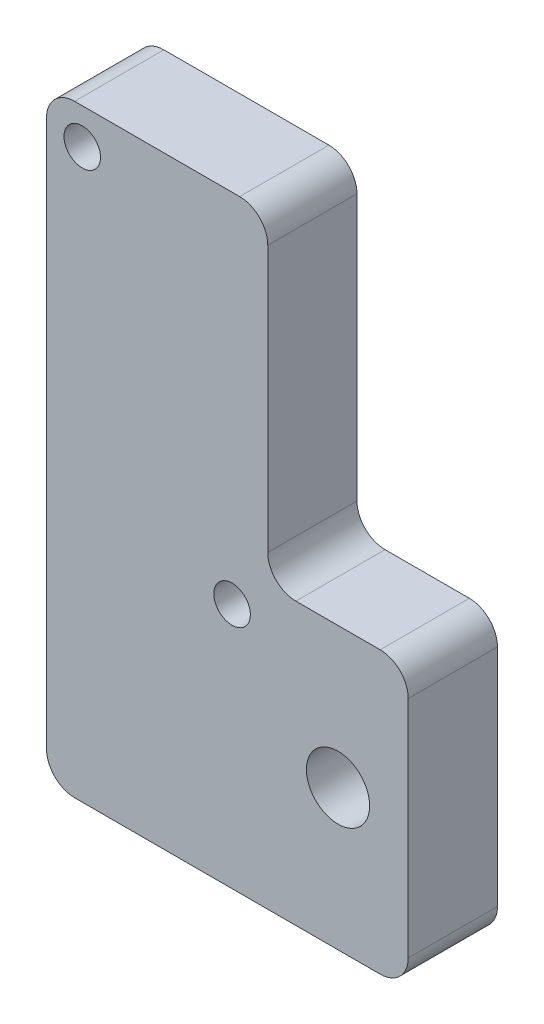
ISO-10303-21;
HEADER;
FILE_DESCRIPTION(('STEP AP214'),'2;1');
FILE_NAME('part.step','',(''),(''),'','','');
FILE_SCHEMA(('AUTOMOTIVE_DESIGN { 1 0 10303 214 1 1 1 1 }'));
ENDSEC;
DATA;
#1=APPLICATION_CONTEXT('core data for automotive mechanical design processes');
#2=APPLICATION_PROTOCOL_DEFINITION('international standard','automotive_design',2000,#1);
#3=PRODUCT_CONTEXT('',#1,'mechanical');
#4=PRODUCT('Part','Part','',(#3));
#5=PRODUCT_RELATED_PRODUCT_CATEGORY('part','',(#4));
#6=PRODUCT_DEFINITION_FORMATION('','',#4);
#7=PRODUCT_DEFINITION_CONTEXT('part definition',#1,'design');
#8=PRODUCT_DEFINITION('design','',#6,#7);
#9=PRODUCT_DEFINITION_SHAPE('','',#8);
#10=(LENGTH_UNIT() NAMED_UNIT(*) SI_UNIT(.MILLI.,.METRE.));
#11=(NAMED_UNIT(*) PLANE_ANGLE_UNIT() SI_UNIT($,.RADIAN.));
#12=(NAMED_UNIT(*) SI_UNIT($,.STERADIAN.) SOLID_ANGLE_UNIT());
#13=UNCERTAINTY_MEASURE_WITH_UNIT(LENGTH_MEASURE(1.E-05),#10,'distance_accuracy_value','');
#14=(GEOMETRIC_REPRESENTATION_CONTEXT(3) GLOBAL_UNCERTAINTY_ASSIGNED_CONTEXT((#13)) GLOBAL_UNIT_ASSIGNED_CONTEXT((#10,
#11,#12)) REPRESENTATION_CONTEXT('',''));
#15=CARTESIAN_POINT('',(0.,0.,0.));
#16=DIRECTION('',(0.,0.,1.));
#17=DIRECTION('',(1.,0.,0.));
#18=AXIS2_PLACEMENT_3D('',#15,#16,#17);
#19=CARTESIAN_POINT('',(0.,0.,6.35));
#20=DIRECTION('',(0.,0.,1.));
#21=DIRECTION('',(1.,0.,0.));
#22=AXIS2_PLACEMENT_3D('',#19,#20,#21);
#23=PLANE('',#22);
#24=CARTESIAN_POINT('',(2.54,25.4,6.35));
#25=DIRECTION('',(0.,0.,1.));
#26=DIRECTION('',(1.,0.,0.));
#27=AXIS2_PLACEMENT_3D('',#24,#25,#26);
#28=CIRCLE('',#27,1.3);
#29=CARTESIAN_POINT('',(3.84,25.4,6.35));
#30=VERTEX_POINT('',#29);
#31=EDGE_CURVE('E235',#30,#30,#28,.T.);
#32=ORIENTED_EDGE('',*,*,#31,.F.);
#33=EDGE_LOOP('',(#32));
#34=FACE_BOUND('',#33,.T.);
#35=DIRECTION('',(1.,0.,0.));
#36=VECTOR('',#35,1.);
#37=CARTESIAN_POINT('',(0.,-15.,6.35));
#38=LINE('',#37,#36);
#39=CARTESIAN_POINT('',(2.,-15.,6.35));
#40=VERTEX_POINT('',#39);
#41=CARTESIAN_POINT('',(23.748,-15.,6.35));
#42=VERTEX_POINT('',#41);
#43=EDGE_CURVE('E228',#40,#42,#38,.T.);
#44=ORIENTED_EDGE('',*,*,#43,.T.);
#45=CARTESIAN_POINT('',(23.748,-13.,6.35));
#46=DIRECTION('',(0.,0.,1.));
#47=DIRECTION('',(1.,0.,0.));
#48=AXIS2_PLACEMENT_3D('',#45,#46,#47);
#49=CIRCLE('',#48,2.);
#50=CARTESIAN_POINT('',(25.748,-13.,6.35));
#51=VERTEX_POINT('',#50);
#52=EDGE_CURVE('E186',#42,#51,#49,.T.);
#53=ORIENTED_EDGE('',*,*,#52,.T.);
#54=DIRECTION('',(0.,1.,0.));
#55=VECTOR('',#54,1.);
#56=CARTESIAN_POINT('',(25.748,-15.,6.35));
#57=LINE('',#56,#55);
#58=CARTESIAN_POINT('',(25.748,3.,6.35));
#59=VERTEX_POINT('',#58);
#60=EDGE_CURVE('E143',#51,#59,#57,.T.);
#61=ORIENTED_EDGE('',*,*,#60,.T.);
#62=CARTESIAN_POINT('',(23.748,3.,6.35));
#63=DIRECTION('',(0.,0.,1.));
#64=DIRECTION('',(1.,0.,0.));
#65=AXIS2_PLACEMENT_3D('',#62,#63,#64);
#66=CIRCLE('',#65,2.);
#67=CARTESIAN_POINT('',(23.748,5.,6.35));
#68=VERTEX_POINT('',#67);
#69=EDGE_CURVE('E179',#59,#68,#66,.T.);
#70=ORIENTED_EDGE('',*,*,#69,.T.);
#71=DIRECTION('',(-1.,0.,0.));
#72=VECTOR('',#71,1.);
#73=CARTESIAN_POINT('',(15.748,5.,6.35));
#74=LINE('',#73,#72);
#75=CARTESIAN_POINT('',(17.748,5.,6.35));
#76=VERTEX_POINT('',#75);
#77=EDGE_CURVE('E220',#68,#76,#74,.T.);
#78=ORIENTED_EDGE('',*,*,#77,.T.);
#79=CARTESIAN_POINT('',(17.748,7.,6.35));
#80=DIRECTION('',(0.,0.,1.));
#81=DIRECTION('',(1.,0.,0.));
#82=AXIS2_PLACEMENT_3D('',#79,#80,#81);
#83=CIRCLE('',#82,2.);
#84=CARTESIAN_POINT('',(15.748,7.,6.35));
#85=VERTEX_POINT('',#84);
#86=EDGE_CURVE('E11',#76,#85,#83,.F.);
#87=ORIENTED_EDGE('',*,*,#86,.T.);
#88=DIRECTION('',(0.,1.,0.));
#89=VECTOR('',#88,1.);
#90=CARTESIAN_POINT('',(15.748,27.94,6.35));
#91=LINE('',#90,#89);
#92=CARTESIAN_POINT('',(15.748,25.94,6.35));
#93=VERTEX_POINT('',#92);
#94=EDGE_CURVE('E219',#85,#93,#91,.T.);
#95=ORIENTED_EDGE('',*,*,#94,.T.);
#96=CARTESIAN_POINT('',(13.748,25.94,6.35));
#97=DIRECTION('',(0.,0.,1.));
#98=DIRECTION('',(1.,0.,0.));
#99=AXIS2_PLACEMENT_3D('',#96,#97,#98);
#100=CIRCLE('',#99,2.);
#101=CARTESIAN_POINT('',(13.748,27.94,6.35));
#102=VERTEX_POINT('',#101);
#103=EDGE_CURVE('E55',#93,#102,#100,.T.);
#104=ORIENTED_EDGE('',*,*,#103,.T.);
#105=DIRECTION('',(-1.,0.,0.));
#106=VECTOR('',#105,1.);
#107=CARTESIAN_POINT('',(0.,27.94,6.35));
#108=LINE('',#107,#106);
#109=CARTESIAN_POINT('',(2.,27.94,6.35));
#110=VERTEX_POINT('',#109);
#111=EDGE_CURVE('E168',#102,#110,#108,.T.);
#112=ORIENTED_EDGE('',*,*,#111,.T.);
#113=CARTESIAN_POINT('',(2.,25.94,6.35));
#114=DIRECTION('',(0.,0.,1.));
#115=DIRECTION('',(1.,0.,0.));
#116=AXIS2_PLACEMENT_3D('',#113,#114,#115);
#117=CIRCLE('',#116,2.);
#118=CARTESIAN_POINT('',(0.,25.94,6.35));
#119=VERTEX_POINT('',#118);
#120=EDGE_CURVE('E182',#110,#119,#117,.T.);
#121=ORIENTED_EDGE('',*,*,#120,.T.);
#122=DIRECTION('',(0.,-1.,0.));
#123=VECTOR('',#122,1.);
#124=CARTESIAN_POINT('',(0.,0.,6.35));
#125=LINE('',#124,#123);
#126=CARTESIAN_POINT('',(0.,-13.,6.35));
#127=VERTEX_POINT('',#126);
#128=EDGE_CURVE('E167',#119,#127,#125,.T.);
#129=ORIENTED_EDGE('',*,*,#128,.T.);
#130=CARTESIAN_POINT('',(2.,-13.,6.35));
#131=DIRECTION('',(0.,0.,1.));
#132=DIRECTION('',(1.,0.,0.));
#133=AXIS2_PLACEMENT_3D('',#130,#131,#132);
#134=CIRCLE('',#133,2.);
#135=EDGE_CURVE('E184',#127,#40,#134,.T.);
#136=ORIENTED_EDGE('',*,*,#135,.T.);
#137=EDGE_LOOP('',(#44,#53,#61,#70,#78,#87,#95,#104,#112,#121,#129,#136));
#138=FACE_BOUND('',#137,.T.);
#139=CARTESIAN_POINT('',(20.748,-5.,6.35));
#140=DIRECTION('',(0.,0.,1.));
#141=DIRECTION('',(1.,0.,0.));
#142=AXIS2_PLACEMENT_3D('',#139,#140,#141);
#143=CIRCLE('',#142,2.25000000000001);
#144=CARTESIAN_POINT('',(22.998,-5.,6.35));
#145=VERTEX_POINT('',#144);
#146=EDGE_CURVE('E156',#145,#145,#143,.T.);
#147=ORIENTED_EDGE('',*,*,#146,.F.);
#148=EDGE_LOOP('',(#147));
#149=FACE_BOUND('',#148,.T.);
#150=CARTESIAN_POINT('',(13.208,2.54,6.35));
#151=DIRECTION('',(0.,0.,1.));
#152=DIRECTION('',(1.,0.,0.));
#153=AXIS2_PLACEMENT_3D('',#150,#151,#152);
#154=CIRCLE('',#153,1.3);
#155=CARTESIAN_POINT('',(14.508,2.54,6.35));
#156=VERTEX_POINT('',#155);
#157=EDGE_CURVE('E241',#156,#156,#154,.T.);
#158=ORIENTED_EDGE('',*,*,#157,.F.);
#159=EDGE_LOOP('',(#158));
#160=FACE_BOUND('',#159,.T.);
#161=ADVANCED_FACE('F33',(#34,#138,#149,#160),#23,.T.);
#162=CARTESIAN_POINT('',(0.,0.,0.));
#163=DIRECTION('',(0.,0.,1.));
#164=DIRECTION('',(1.,0.,0.));
#165=AXIS2_PLACEMENT_3D('',#162,#163,#164);
#166=PLANE('',#165);
#167=CARTESIAN_POINT('',(2.54,25.4,0.));
#168=DIRECTION('',(0.,0.,1.));
#169=DIRECTION('',(1.,0.,0.));
#170=AXIS2_PLACEMENT_3D('',#167,#168,#169);
#171=CIRCLE('',#170,1.3);
#172=CARTESIAN_POINT('',(3.84,25.4,0.));
#173=VERTEX_POINT('',#172);
#174=EDGE_CURVE('E238',#173,#173,#171,.T.);
#175=ORIENTED_EDGE('',*,*,#174,.T.);
#176=EDGE_LOOP('',(#175));
#177=FACE_BOUND('',#176,.T.);
#178=DIRECTION('',(0.,1.,0.));
#179=VECTOR('',#178,1.);
#180=CARTESIAN_POINT('',(25.748,5.,0.));
#181=LINE('',#180,#179);
#182=CARTESIAN_POINT('',(25.748,-13.,0.));
#183=VERTEX_POINT('',#182);
#184=CARTESIAN_POINT('',(25.748,3.,0.));
#185=VERTEX_POINT('',#184);
#186=EDGE_CURVE('E140',#183,#185,#181,.T.);
#187=ORIENTED_EDGE('',*,*,#186,.F.);
#188=CARTESIAN_POINT('',(23.748,-13.,0.));
#189=DIRECTION('',(0.,0.,1.));
#190=DIRECTION('',(1.,0.,0.));
#191=AXIS2_PLACEMENT_3D('',#188,#189,#190);
#192=CIRCLE('',#191,2.);
#193=CARTESIAN_POINT('',(23.748,-15.,0.));
#194=VERTEX_POINT('',#193);
#195=EDGE_CURVE('E123',#183,#194,#192,.F.);
#196=ORIENTED_EDGE('',*,*,#195,.T.);
#197=DIRECTION('',(1.,0.,0.));
#198=VECTOR('',#197,1.);
#199=CARTESIAN_POINT('',(0.,-15.,0.));
#200=LINE('',#199,#198);
#201=CARTESIAN_POINT('',(2.,-15.,0.));
#202=VERTEX_POINT('',#201);
#203=EDGE_CURVE('E151',#202,#194,#200,.T.);
#204=ORIENTED_EDGE('',*,*,#203,.F.);
#205=CARTESIAN_POINT('',(2.,-13.,0.));
#206=DIRECTION('',(0.,0.,1.));
#207=DIRECTION('',(1.,0.,0.));
#208=AXIS2_PLACEMENT_3D('',#205,#206,#207);
#209=CIRCLE('',#208,2.);
#210=CARTESIAN_POINT('',(0.,-13.,0.));
#211=VERTEX_POINT('',#210);
#212=EDGE_CURVE('E134',#202,#211,#209,.F.);
#213=ORIENTED_EDGE('',*,*,#212,.T.);
#214=DIRECTION('',(0.,-1.,0.));
#215=VECTOR('',#214,1.);
#216=CARTESIAN_POINT('',(0.,0.,0.));
#217=LINE('',#216,#215);
#218=CARTESIAN_POINT('',(0.,25.94,0.));
#219=VERTEX_POINT('',#218);
#220=EDGE_CURVE('E164',#219,#211,#217,.T.);
#221=ORIENTED_EDGE('',*,*,#220,.F.);
#222=CARTESIAN_POINT('',(2.,25.94,0.));
#223=DIRECTION('',(0.,0.,1.));
#224=DIRECTION('',(1.,0.,0.));
#225=AXIS2_PLACEMENT_3D('',#222,#223,#224);
#226=CIRCLE('',#225,2.);
#227=CARTESIAN_POINT('',(2.,27.94,0.));
#228=VERTEX_POINT('',#227);
#229=EDGE_CURVE('E173',#219,#228,#226,.F.);
#230=ORIENTED_EDGE('',*,*,#229,.T.);
#231=DIRECTION('',(-1.,0.,0.));
#232=VECTOR('',#231,1.);
#233=CARTESIAN_POINT('',(0.,27.94,0.));
#234=LINE('',#233,#232);
#235=CARTESIAN_POINT('',(13.748,27.94,0.));
#236=VERTEX_POINT('',#235);
#237=EDGE_CURVE('E162',#236,#228,#234,.T.);
#238=ORIENTED_EDGE('',*,*,#237,.F.);
#239=CARTESIAN_POINT('',(13.748,25.94,0.));
#240=DIRECTION('',(0.,0.,1.));
#241=DIRECTION('',(1.,0.,0.));
#242=AXIS2_PLACEMENT_3D('',#239,#240,#241);
#243=CIRCLE('',#242,2.);
#244=CARTESIAN_POINT('',(15.748,25.94,0.));
#245=VERTEX_POINT('',#244);
#246=EDGE_CURVE('E171',#236,#245,#243,.F.);
#247=ORIENTED_EDGE('',*,*,#246,.T.);
#248=DIRECTION('',(0.,1.,0.));
#249=VECTOR('',#248,1.);
#250=CARTESIAN_POINT('',(15.748,27.94,0.));
#251=LINE('',#250,#249);
#252=CARTESIAN_POINT('',(15.748,7.,0.));
#253=VERTEX_POINT('',#252);
#254=EDGE_CURVE('E154',#253,#245,#251,.T.);
#255=ORIENTED_EDGE('',*,*,#254,.F.);
#256=CARTESIAN_POINT('',(17.748,7.,0.));
#257=DIRECTION('',(0.,0.,1.));
#258=DIRECTION('',(1.,0.,0.));
#259=AXIS2_PLACEMENT_3D('',#256,#257,#258);
#260=CIRCLE('',#259,2.);
#261=CARTESIAN_POINT('',(17.748,5.,0.));
#262=VERTEX_POINT('',#261);
#263=EDGE_CURVE('E41',#253,#262,#260,.T.);
#264=ORIENTED_EDGE('',*,*,#263,.T.);
#265=DIRECTION('',(-1.,0.,0.));
#266=VECTOR('',#265,1.);
#267=CARTESIAN_POINT('',(15.748,5.,0.));
#268=LINE('',#267,#266);
#269=CARTESIAN_POINT('',(23.748,5.,0.));
#270=VERTEX_POINT('',#269);
#271=EDGE_CURVE('E150',#270,#262,#268,.T.);
#272=ORIENTED_EDGE('',*,*,#271,.F.);
#273=CARTESIAN_POINT('',(23.748,3.,0.));
#274=DIRECTION('',(0.,0.,1.));
#275=DIRECTION('',(1.,0.,0.));
#276=AXIS2_PLACEMENT_3D('',#273,#274,#275);
#277=CIRCLE('',#276,2.);
#278=EDGE_CURVE('E144',#270,#185,#277,.F.);
#279=ORIENTED_EDGE('',*,*,#278,.T.);
#280=EDGE_LOOP('',(#187,#196,#204,#213,#221,#230,#238,#247,#255,#264,#272,#279));
#281=FACE_BOUND('',#280,.T.);
#282=CARTESIAN_POINT('',(20.748,-5.,0.));
#283=DIRECTION('',(0.,0.,1.));
#284=DIRECTION('',(1.,0.,0.));
#285=AXIS2_PLACEMENT_3D('',#282,#283,#284);
#286=CIRCLE('',#285,2.25000000000001);
#287=CARTESIAN_POINT('',(22.998,-5.,0.));
#288=VERTEX_POINT('',#287);
#289=EDGE_CURVE('E232',#288,#288,#286,.T.);
#290=ORIENTED_EDGE('',*,*,#289,.T.);
#291=EDGE_LOOP('',(#290));
#292=FACE_BOUND('',#291,.T.);
#293=CARTESIAN_POINT('',(13.208,2.54,0.));
#294=DIRECTION('',(0.,0.,1.));
#295=DIRECTION('',(1.,0.,0.));
#296=AXIS2_PLACEMENT_3D('',#293,#294,#295);
#297=CIRCLE('',#296,1.3);
#298=CARTESIAN_POINT('',(14.508,2.54,0.));
#299=VERTEX_POINT('',#298);
#300=EDGE_CURVE('E244',#299,#299,#297,.T.);
#301=ORIENTED_EDGE('',*,*,#300,.T.);
#302=EDGE_LOOP('',(#301));
#303=FACE_BOUND('',#302,.T.);
#304=ADVANCED_FACE('F147',(#177,#281,#292,#303),#166,.F.);
#305=CARTESIAN_POINT('',(0.,-15.,6.35));
#306=DIRECTION('',(0.,1.,0.));
#307=DIRECTION('',(0.,0.,1.));
#308=AXIS2_PLACEMENT_3D('',#305,#306,#307);
#309=PLANE('',#308);
#310=ORIENTED_EDGE('',*,*,#203,.T.);
#311=DIRECTION('',(0.,0.,-1.));
#312=VECTOR('',#311,1.);
#313=CARTESIAN_POINT('',(23.748,-15.,6.35));
#314=LINE('',#313,#312);
#315=EDGE_CURVE('E128',#194,#42,#314,.F.);
#316=ORIENTED_EDGE('',*,*,#315,.T.);
#317=ORIENTED_EDGE('',*,*,#43,.F.);
#318=DIRECTION('',(0.,0.,-1.));
#319=VECTOR('',#318,1.);
#320=CARTESIAN_POINT('',(2.,-15.,6.35));
#321=LINE('',#320,#319);
#322=EDGE_CURVE('E133',#40,#202,#321,.T.);
#323=ORIENTED_EDGE('',*,*,#322,.T.);
#324=EDGE_LOOP('',(#310,#316,#317,#323));
#325=FACE_BOUND('',#324,.T.);
#326=ADVANCED_FACE('F259',(#325),#309,.F.);
#327=CARTESIAN_POINT('',(25.748,5.,6.35));
#328=DIRECTION('',(-1.,0.,0.));
#329=DIRECTION('',(0.,0.,1.));
#330=AXIS2_PLACEMENT_3D('',#327,#328,#329);
#331=PLANE('',#330);
#332=ORIENTED_EDGE('',*,*,#60,.F.);
#333=DIRECTION('',(0.,0.,-1.));
#334=VECTOR('',#333,1.);
#335=CARTESIAN_POINT('',(25.748,-13.,6.35));
#336=LINE('',#335,#334);
#337=EDGE_CURVE('E127',#51,#183,#336,.T.);
#338=ORIENTED_EDGE('',*,*,#337,.T.);
#339=ORIENTED_EDGE('',*,*,#186,.T.);
#340=DIRECTION('',(0.,0.,-1.));
#341=VECTOR('',#340,1.);
#342=CARTESIAN_POINT('',(25.748,3.,6.35));
#343=LINE('',#342,#341);
#344=EDGE_CURVE('E145',#185,#59,#343,.F.);
#345=ORIENTED_EDGE('',*,*,#344,.T.);
#346=EDGE_LOOP('',(#332,#338,#339,#345));
#347=FACE_BOUND('',#346,.T.);
#348=ADVANCED_FACE('F139',(#347),#331,.F.);
#349=CARTESIAN_POINT('',(15.748,5.,6.35));
#350=DIRECTION('',(0.,-1.,0.));
#351=DIRECTION('',(0.,0.,-1.));
#352=AXIS2_PLACEMENT_3D('',#349,#350,#351);
#353=PLANE('',#352);
#354=ORIENTED_EDGE('',*,*,#77,.F.);
#355=DIRECTION('',(0.,0.,-1.));
#356=VECTOR('',#355,1.);
#357=CARTESIAN_POINT('',(23.748,5.,6.35));
#358=LINE('',#357,#356);
#359=EDGE_CURVE('E204',#68,#270,#358,.T.);
#360=ORIENTED_EDGE('',*,*,#359,.T.);
#361=ORIENTED_EDGE('',*,*,#271,.T.);
#362=DIRECTION('',(0.,0.,-1.));
#363=VECTOR('',#362,1.);
#364=CARTESIAN_POINT('',(17.748,5.,6.35));
#365=LINE('',#364,#363);
#366=EDGE_CURVE('E202',#262,#76,#365,.F.);
#367=ORIENTED_EDGE('',*,*,#366,.T.);
#368=EDGE_LOOP('',(#354,#360,#361,#367));
#369=FACE_BOUND('',#368,.T.);
#370=ADVANCED_FACE('F212',(#369),#353,.F.);
#371=CARTESIAN_POINT('',(15.748,27.94,6.35));
#372=DIRECTION('',(-1.,0.,0.));
#373=DIRECTION('',(0.,0.,1.));
#374=AXIS2_PLACEMENT_3D('',#371,#372,#373);
#375=PLANE('',#374);
#376=ORIENTED_EDGE('',*,*,#254,.T.);
#377=DIRECTION('',(0.,0.,-1.));
#378=VECTOR('',#377,1.);
#379=CARTESIAN_POINT('',(15.748,25.94,6.35));
#380=LINE('',#379,#378);
#381=EDGE_CURVE('E200',#245,#93,#380,.F.);
#382=ORIENTED_EDGE('',*,*,#381,.T.);
#383=ORIENTED_EDGE('',*,*,#94,.F.);
#384=DIRECTION('',(0.,0.,-1.));
#385=VECTOR('',#384,1.);
#386=CARTESIAN_POINT('',(15.748,7.,0.));
#387=LINE('',#386,#385);
#388=EDGE_CURVE('E197',#85,#253,#387,.T.);
#389=ORIENTED_EDGE('',*,*,#388,.T.);
#390=EDGE_LOOP('',(#376,#382,#383,#389));
#391=FACE_BOUND('',#390,.T.);
#392=ADVANCED_FACE('F222',(#391),#375,.F.);
#393=CARTESIAN_POINT('',(0.,27.94,6.35));
#394=DIRECTION('',(0.,-1.,0.));
#395=DIRECTION('',(0.,0.,-1.));
#396=AXIS2_PLACEMENT_3D('',#393,#394,#395);
#397=PLANE('',#396);
#398=ORIENTED_EDGE('',*,*,#237,.T.);
#399=DIRECTION('',(0.,0.,-1.));
#400=VECTOR('',#399,1.);
#401=CARTESIAN_POINT('',(2.,27.94,6.35));
#402=LINE('',#401,#400);
#403=EDGE_CURVE('E48',#228,#110,#402,.F.);
#404=ORIENTED_EDGE('',*,*,#403,.T.);
#405=ORIENTED_EDGE('',*,*,#111,.F.);
#406=DIRECTION('',(0.,0.,-1.));
#407=VECTOR('',#406,1.);
#408=CARTESIAN_POINT('',(13.748,27.94,6.35));
#409=LINE('',#408,#407);
#410=EDGE_CURVE('E193',#102,#236,#409,.T.);
#411=ORIENTED_EDGE('',*,*,#410,.T.);
#412=EDGE_LOOP('',(#398,#404,#405,#411));
#413=FACE_BOUND('',#412,.T.);
#414=ADVANCED_FACE('F270',(#413),#397,.F.);
#415=CARTESIAN_POINT('',(0.,0.,6.35));
#416=DIRECTION('',(1.,0.,0.));
#417=DIRECTION('',(0.,0.,-1.));
#418=AXIS2_PLACEMENT_3D('',#415,#416,#417);
#419=PLANE('',#418);
#420=ORIENTED_EDGE('',*,*,#220,.T.);
#421=DIRECTION('',(0.,0.,-1.));
#422=VECTOR('',#421,1.);
#423=CARTESIAN_POINT('',(0.,-13.,6.35));
#424=LINE('',#423,#422);
#425=EDGE_CURVE('E191',#211,#127,#424,.F.);
#426=ORIENTED_EDGE('',*,*,#425,.T.);
#427=ORIENTED_EDGE('',*,*,#128,.F.);
#428=DIRECTION('',(0.,0.,-1.));
#429=VECTOR('',#428,1.);
#430=CARTESIAN_POINT('',(0.,25.94,6.35));
#431=LINE('',#430,#429);
#432=EDGE_CURVE('E188',#119,#219,#431,.T.);
#433=ORIENTED_EDGE('',*,*,#432,.T.);
#434=EDGE_LOOP('',(#420,#426,#427,#433));
#435=FACE_BOUND('',#434,.T.);
#436=ADVANCED_FACE('F267',(#435),#419,.F.);
#437=CARTESIAN_POINT('',(20.748,-5.,6.35));
#438=DIRECTION('',(0.,0.,-1.));
#439=DIRECTION('',(-1.,0.,0.));
#440=AXIS2_PLACEMENT_3D('',#437,#438,#439);
#441=CYLINDRICAL_SURFACE('',#440,2.25000000000001);
#442=ORIENTED_EDGE('',*,*,#146,.T.);
#443=EDGE_LOOP('',(#442));
#444=FACE_BOUND('',#443,.T.);
#445=ORIENTED_EDGE('',*,*,#289,.F.);
#446=EDGE_LOOP('',(#445));
#447=FACE_BOUND('',#446,.T.);
#448=ADVANCED_FACE('F264',(#444,#447),#441,.F.);
#449=CARTESIAN_POINT('',(2.54,25.4,6.35));
#450=DIRECTION('',(0.,0.,-1.));
#451=DIRECTION('',(-1.,0.,0.));
#452=AXIS2_PLACEMENT_3D('',#449,#450,#451);
#453=CYLINDRICAL_SURFACE('',#452,1.3);
#454=ORIENTED_EDGE('',*,*,#31,.T.);
#455=EDGE_LOOP('',(#454));
#456=FACE_BOUND('',#455,.T.);
#457=ORIENTED_EDGE('',*,*,#174,.F.);
#458=EDGE_LOOP('',(#457));
#459=FACE_BOUND('',#458,.T.);
#460=ADVANCED_FACE('F402',(#456,#459),#453,.F.);
#461=CARTESIAN_POINT('',(13.208,2.54,6.35));
#462=DIRECTION('',(0.,0.,-1.));
#463=DIRECTION('',(-1.,0.,0.));
#464=AXIS2_PLACEMENT_3D('',#461,#462,#463);
#465=CYLINDRICAL_SURFACE('',#464,1.3);
#466=ORIENTED_EDGE('',*,*,#157,.T.);
#467=EDGE_LOOP('',(#466));
#468=FACE_BOUND('',#467,.T.);
#469=ORIENTED_EDGE('',*,*,#300,.F.);
#470=EDGE_LOOP('',(#469));
#471=FACE_BOUND('',#470,.T.);
#472=ADVANCED_FACE('F250',(#468,#471),#465,.F.);
#473=CARTESIAN_POINT('',(23.748,-13.,6.35));
#474=DIRECTION('',(0.,0.,-1.));
#475=DIRECTION('',(-1.,0.,0.));
#476=AXIS2_PLACEMENT_3D('',#473,#474,#475);
#477=CYLINDRICAL_SURFACE('',#476,2.);
#478=ORIENTED_EDGE('',*,*,#52,.F.);
#479=ORIENTED_EDGE('',*,*,#315,.F.);
#480=ORIENTED_EDGE('',*,*,#195,.F.);
#481=ORIENTED_EDGE('',*,*,#337,.F.);
#482=EDGE_LOOP('',(#478,#479,#480,#481));
#483=FACE_BOUND('',#482,.T.);
#484=ADVANCED_FACE('F126',(#483),#477,.T.);
#485=CARTESIAN_POINT('',(2.,-13.,6.35));
#486=DIRECTION('',(0.,0.,-1.));
#487=DIRECTION('',(-1.,0.,0.));
#488=AXIS2_PLACEMENT_3D('',#485,#486,#487);
#489=CYLINDRICAL_SURFACE('',#488,2.);
#490=ORIENTED_EDGE('',*,*,#135,.F.);
#491=ORIENTED_EDGE('',*,*,#425,.F.);
#492=ORIENTED_EDGE('',*,*,#212,.F.);
#493=ORIENTED_EDGE('',*,*,#322,.F.);
#494=EDGE_LOOP('',(#490,#491,#492,#493));
#495=FACE_BOUND('',#494,.T.);
#496=ADVANCED_FACE('F285',(#495),#489,.T.);
#497=CARTESIAN_POINT('',(2.,25.94,6.35));
#498=DIRECTION('',(0.,0.,-1.));
#499=DIRECTION('',(-1.,0.,0.));
#500=AXIS2_PLACEMENT_3D('',#497,#498,#499);
#501=CYLINDRICAL_SURFACE('',#500,2.);
#502=ORIENTED_EDGE('',*,*,#120,.F.);
#503=ORIENTED_EDGE('',*,*,#403,.F.);
#504=ORIENTED_EDGE('',*,*,#229,.F.);
#505=ORIENTED_EDGE('',*,*,#432,.F.);
#506=EDGE_LOOP('',(#502,#503,#504,#505));
#507=FACE_BOUND('',#506,.T.);
#508=ADVANCED_FACE('F288',(#507),#501,.T.);
#509=CARTESIAN_POINT('',(13.748,25.94,6.35));
#510=DIRECTION('',(0.,0.,-1.));
#511=DIRECTION('',(-1.,0.,0.));
#512=AXIS2_PLACEMENT_3D('',#509,#510,#511);
#513=CYLINDRICAL_SURFACE('',#512,2.);
#514=ORIENTED_EDGE('',*,*,#103,.F.);
#515=ORIENTED_EDGE('',*,*,#381,.F.);
#516=ORIENTED_EDGE('',*,*,#246,.F.);
#517=ORIENTED_EDGE('',*,*,#410,.F.);
#518=EDGE_LOOP('',(#514,#515,#516,#517));
#519=FACE_BOUND('',#518,.T.);
#520=ADVANCED_FACE('F292',(#519),#513,.T.);
#521=CARTESIAN_POINT('',(23.748,3.,6.35));
#522=DIRECTION('',(0.,0.,-1.));
#523=DIRECTION('',(-1.,0.,0.));
#524=AXIS2_PLACEMENT_3D('',#521,#522,#523);
#525=CYLINDRICAL_SURFACE('',#524,2.);
#526=ORIENTED_EDGE('',*,*,#69,.F.);
#527=ORIENTED_EDGE('',*,*,#344,.F.);
#528=ORIENTED_EDGE('',*,*,#278,.F.);
#529=ORIENTED_EDGE('',*,*,#359,.F.);
#530=EDGE_LOOP('',(#526,#527,#528,#529));
#531=FACE_BOUND('',#530,.T.);
#532=ADVANCED_FACE('F295',(#531),#525,.T.);
#533=CARTESIAN_POINT('',(17.748,7.,6.35));
#534=DIRECTION('',(0.,0.,1.));
#535=DIRECTION('',(1.,0.,0.));
#536=AXIS2_PLACEMENT_3D('',#533,#534,#535);
#537=CYLINDRICAL_SURFACE('',#536,2.);
#538=ORIENTED_EDGE('',*,*,#86,.F.);
#539=ORIENTED_EDGE('',*,*,#366,.F.);
#540=ORIENTED_EDGE('',*,*,#263,.F.);
#541=ORIENTED_EDGE('',*,*,#388,.F.);
#542=EDGE_LOOP('',(#538,#539,#540,#541));
#543=FACE_BOUND('',#542,.T.);
#544=ADVANCED_FACE('F35',(#543),#537,.F.);
#545=CLOSED_SHELL('',(#161,#304,#326,#348,#370,#392,#414,#436,#448,#460,#472,#484,#496,#508,
#520,#532,#544));
#546=MANIFOLD_SOLID_BREP('B2',#545);
#547=ADVANCED_BREP_SHAPE_REPRESENTATION('',(#18,#546),#14);
#548=SHAPE_DEFINITION_REPRESENTATION(#9,#547);
ENDSEC;
END-ISO-10303-21;
